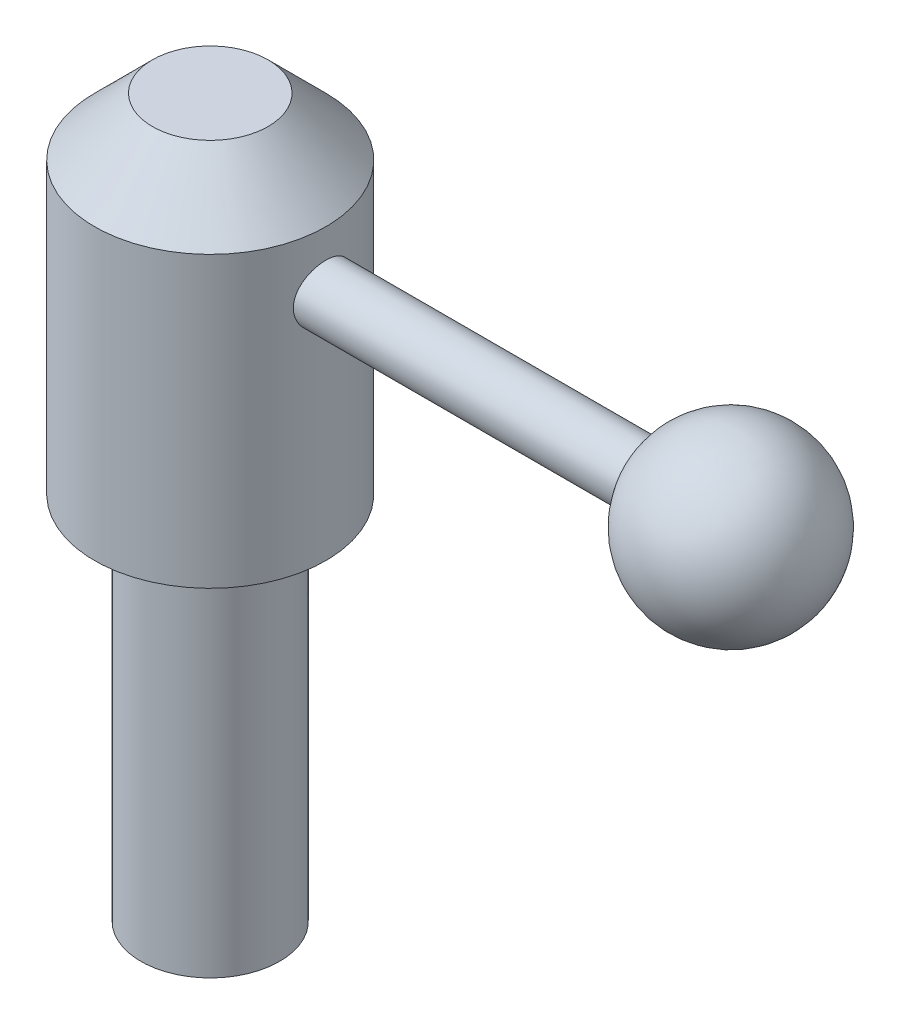
ISO-10303-21;
HEADER;
FILE_DESCRIPTION(('STEP AP214'),'2;1');
FILE_NAME('part.step','',(''),(''),'','','');
FILE_SCHEMA(('AUTOMOTIVE_DESIGN { 1 0 10303 214 1 1 1 1 }'));
ENDSEC;
DATA;
#1=APPLICATION_CONTEXT('core data for automotive mechanical design processes');
#2=APPLICATION_PROTOCOL_DEFINITION('international standard','automotive_design',2000,#1);
#3=PRODUCT_CONTEXT('',#1,'mechanical');
#4=PRODUCT('Part','Part','',(#3));
#5=PRODUCT_RELATED_PRODUCT_CATEGORY('part','',(#4));
#6=PRODUCT_DEFINITION_FORMATION('','',#4);
#7=PRODUCT_DEFINITION_CONTEXT('part definition',#1,'design');
#8=PRODUCT_DEFINITION('design','',#6,#7);
#9=PRODUCT_DEFINITION_SHAPE('','',#8);
#10=(LENGTH_UNIT() NAMED_UNIT(*) SI_UNIT(.MILLI.,.METRE.));
#11=(NAMED_UNIT(*) PLANE_ANGLE_UNIT() SI_UNIT($,.RADIAN.));
#12=(NAMED_UNIT(*) SI_UNIT($,.STERADIAN.) SOLID_ANGLE_UNIT());
#13=UNCERTAINTY_MEASURE_WITH_UNIT(LENGTH_MEASURE(1.E-05),#10,'distance_accuracy_value','');
#14=(GEOMETRIC_REPRESENTATION_CONTEXT(3) GLOBAL_UNCERTAINTY_ASSIGNED_CONTEXT((#13)) GLOBAL_UNIT_ASSIGNED_CONTEXT((#10,
#11,#12)) REPRESENTATION_CONTEXT('',''));
#15=CARTESIAN_POINT('',(0.,0.,0.));
#16=DIRECTION('',(0.,0.,1.));
#17=DIRECTION('',(1.,0.,0.));
#18=AXIS2_PLACEMENT_3D('',#15,#16,#17);
#19=CARTESIAN_POINT('',(0.,0.,0.));
#20=DIRECTION('',(0.,-1.,0.));
#21=DIRECTION('',(0.,0.,-1.));
#22=AXIS2_PLACEMENT_3D('',#19,#20,#21);
#23=CYLINDRICAL_SURFACE('',#22,10.);
#24=CARTESIAN_POINT('',(0.,57.,0.));
#25=DIRECTION('',(0.,-1.,0.));
#26=DIRECTION('',(0.,0.,-1.));
#27=AXIS2_PLACEMENT_3D('',#24,#25,#26);
#28=CIRCLE('',#27,10.);
#29=CARTESIAN_POINT('',(0.,57.,-10.));
#30=VERTEX_POINT('',#29);
#31=EDGE_CURVE('E64',#30,#30,#28,.T.);
#32=ORIENTED_EDGE('',*,*,#31,.T.);
#33=EDGE_LOOP('',(#32));
#34=FACE_BOUND('',#33,.T.);
#35=CARTESIAN_POINT('',(0.,32.,0.));
#36=DIRECTION('',(0.,-1.,0.));
#37=DIRECTION('',(0.,0.,-1.));
#38=AXIS2_PLACEMENT_3D('',#35,#36,#37);
#39=CIRCLE('',#38,9.99999999999999);
#40=CARTESIAN_POINT('',(0.,32.,-9.99999999999999));
#41=VERTEX_POINT('',#40);
#42=EDGE_CURVE('E69',#41,#41,#39,.T.);
#43=ORIENTED_EDGE('',*,*,#42,.F.);
#44=EDGE_LOOP('',(#43));
#45=FACE_BOUND('',#44,.T.);
#46=CARTESIAN_POINT('',(9.68245836551854,52.,2.5));
#47=CARTESIAN_POINT('',(9.68246100087859,51.8619492490734,2.49999607859307));
#48=CARTESIAN_POINT('',(9.68544306014597,51.7238551013215,2.48852624549765));
#49=CARTESIAN_POINT('',(9.69701861992564,51.4516324218265,2.44302312546379));
#50=CARTESIAN_POINT('',(9.7056153862163,51.3175062455318,2.40897670674211));
#51=CARTESIAN_POINT('',(9.7273872459615,51.0571964618128,2.31949119963204));
#52=CARTESIAN_POINT('',(9.74055642690458,50.9310028446143,2.26407972785449));
#53=CARTESIAN_POINT('',(9.76998192028759,50.6896891474601,2.13352114126139));
#54=CARTESIAN_POINT('',(9.78623836378489,50.5745695379198,2.05837318856069));
#55=CARTESIAN_POINT('',(9.82040716355625,50.3561383547378,1.88870842731188));
#56=CARTESIAN_POINT('',(9.83834597623034,50.25310639965,1.79383688770405));
#57=CARTESIAN_POINT('',(9.87362875515294,50.0642386056397,1.58818206410066));
#58=CARTESIAN_POINT('',(9.89097266566388,49.9784043743783,1.4773972941803));
#59=CARTESIAN_POINT('',(9.92340415520582,49.8252245323687,1.24114520107895));
#60=CARTESIAN_POINT('',(9.93845687400592,49.7581536118385,1.11549457619512));
#61=CARTESIAN_POINT('',(9.96430811925984,49.6461903558469,0.854263184292759));
#62=CARTESIAN_POINT('',(9.97510727334344,49.6012947480845,0.718683885791938));
#63=CARTESIAN_POINT('',(9.9910475884818,49.5358521654214,0.44435875875416));
#64=CARTESIAN_POINT('',(9.99629893844314,49.5148303556734,0.305732719548973));
#65=CARTESIAN_POINT('',(10.000935941073,49.4962416207244,0.0268288192627658));
#66=CARTESIAN_POINT('',(10.000322460967,49.4986712277904,-0.113448794538073));
#67=CARTESIAN_POINT('',(9.99338094953533,49.5265748502501,-0.388380617930973));
#68=CARTESIAN_POINT('',(9.9871800234087,49.5515363250539,-0.523090539002673));
#69=CARTESIAN_POINT('',(9.96990836524857,49.6229712700485,-0.786345618534221));
#70=CARTESIAN_POINT('',(9.95883737398452,49.6694458853774,-0.9148904484261));
#71=CARTESIAN_POINT('',(9.93287509700884,49.7830025706871,-1.16351675875452));
#72=CARTESIAN_POINT('',(9.9179501969501,49.8502670446617,-1.28351127441626));
#73=CARTESIAN_POINT('',(9.88589903809692,50.0033556791163,-1.51068905585123));
#74=CARTESIAN_POINT('',(9.8687723965265,50.0891830685606,-1.61787008771377));
#75=CARTESIAN_POINT('',(9.83363713769356,50.2797087419824,-1.81943508771239));
#76=CARTESIAN_POINT('',(9.81561719525297,50.3848548923478,-1.91339419768799));
#77=CARTESIAN_POINT('',(9.78115043517327,50.6095999735403,-2.08244093990756));
#78=CARTESIAN_POINT('',(9.76470369108288,50.7291995794911,-2.15752769011507));
#79=CARTESIAN_POINT('',(9.73520496829319,50.9802900341489,-2.28697032255647));
#80=CARTESIAN_POINT('',(9.72216983717007,51.1118357303128,-2.34122391742613));
#81=CARTESIAN_POINT('',(9.70118640148668,51.3825854680769,-2.42671405159096));
#82=CARTESIAN_POINT('',(9.69323700842732,51.5217878639846,-2.45795551638266));
#83=CARTESIAN_POINT('',(9.68355356007456,51.7999595015299,-2.49582963866592));
#84=CARTESIAN_POINT('',(9.68166088976933,51.938837793341,-2.50309047391912));
#85=CARTESIAN_POINT('',(9.68387343364692,52.2158219365853,-2.49451699051516));
#86=CARTESIAN_POINT('',(9.687978095703,52.3539278579494,-2.47868479784981));
#87=CARTESIAN_POINT('',(9.70157081984979,52.6231142649486,-2.42492546393825));
#88=CARTESIAN_POINT('',(9.71096970242531,52.7542727265692,-2.38736406828191));
#89=CARTESIAN_POINT('',(9.73400718262805,53.0084314578533,-2.29161808167046));
#90=CARTESIAN_POINT('',(9.74764628246407,53.1314307590558,-2.2334310477125));
#91=CARTESIAN_POINT('',(9.77796137095511,53.3684412778669,-2.0967706679366));
#92=CARTESIAN_POINT('',(9.79469168607245,53.482228840043,-2.01792175383564));
#93=CARTESIAN_POINT('',(9.82917083071113,53.6951883628015,-1.84265073233612));
#94=CARTESIAN_POINT('',(9.84691982728307,53.7943579166501,-1.74622573701359));
#95=CARTESIAN_POINT('',(9.88197403031773,53.9778110425709,-1.53565680246181));
#96=CARTESIAN_POINT('',(9.8992570206188,54.0616600625488,-1.42112988132898));
#97=CARTESIAN_POINT('',(9.93097216613689,54.2089358669513,-1.17925670673668));
#98=CARTESIAN_POINT('',(9.94540447003949,54.2723637166082,-1.05191112239397));
#99=CARTESIAN_POINT('',(9.96970115738325,54.3764460345279,-0.788895504327726));
#100=CARTESIAN_POINT('',(9.97959830022409,54.4172642843791,-0.653293452569705));
#101=CARTESIAN_POINT('',(9.99385293395789,54.4754603346084,-0.376874400797017));
#102=CARTESIAN_POINT('',(9.99821149393421,54.492842658739,-0.236058412603101));
#103=CARTESIAN_POINT('',(10.0008542352202,54.5034189739388,0.0427088161083089));
#104=CARTESIAN_POINT('',(9.99929947199971,54.4972542727385,0.180634567415056));
#105=CARTESIAN_POINT('',(9.99064741143608,54.4623804317641,0.453418741036879));
#106=CARTESIAN_POINT('',(9.98355027892922,54.4336719624671,0.588277254452324));
#107=CARTESIAN_POINT('',(9.96463582134723,54.3548694505729,0.850427589111937));
#108=CARTESIAN_POINT('',(9.95284411255981,54.3048913667141,0.977756236452158));
#109=CARTESIAN_POINT('',(9.92578222284145,54.1850735524511,1.22229263260406));
#110=CARTESIAN_POINT('',(9.91051160346894,54.1152313183238,1.33949910316409));
#111=CARTESIAN_POINT('',(9.87768124200717,53.9557119150097,1.56350482105826));
#112=CARTESIAN_POINT('',(9.86007542354161,53.8655996427404,1.66998747074584));
#113=CARTESIAN_POINT('',(9.82476622642974,53.6689428700566,1.86653755068376));
#114=CARTESIAN_POINT('',(9.80706282418255,53.5623942097221,1.95660081269148));
#115=CARTESIAN_POINT('',(9.77318689613756,53.3334964645263,2.11940506617958));
#116=CARTESIAN_POINT('',(9.75704909183222,53.2108896915869,2.19179154854095));
#117=CARTESIAN_POINT('',(9.7285988873707,52.954861275313,2.31481724146368));
#118=CARTESIAN_POINT('',(9.71628370583034,52.8214475847654,2.36547227438038));
#119=CARTESIAN_POINT('',(9.69879771876843,52.5735574704121,2.43605632142751));
#120=CARTESIAN_POINT('',(9.69271657508747,52.4602670890347,2.4599829264922));
#121=CARTESIAN_POINT('',(9.6845459645655,52.2313278275058,2.49195573142943));
#122=CARTESIAN_POINT('',(9.68245615722769,52.115679149389,2.50000328592938));
#123=CARTESIAN_POINT('',(9.68245836551854,52.,2.5));
#124=B_SPLINE_CURVE_WITH_KNOTS('',3,(#46,#47,#48,#49,#50,#51,#52,#53,#54,#55,#56,#57,#58,#59,
#60,#61,#62,#63,#64,#65,#66,#67,#68,#69,#70,#71,#72,#73,#74,#75,#76,#77,#78,#79,#80,#81,#82,#83,
#84,#85,#86,#87,#88,#89,#90,#91,#92,#93,#94,#95,#96,#97,#98,#99,#100,#101,#102,#103,#104,#105,
#106,#107,#108,#109,#110,#111,#112,#113,#114,#115,#116,#117,#118,#119,#120,#121,#122,#123),
.UNSPECIFIED.,.T.,.F.,(4,2,2,2,2,2,2,2,2,2,2,2,2,2,2,2,2,2,2,2,2,2,2,2,2,2,2,2,2,2,2,2,2,2,2,2,
2,2,4),(0.,0.413727441736142,0.82769574142867,1.24113072716601,1.65458326755479,
2.07623954192977,2.49793521479867,2.92551496397921,3.35303159847093,3.77188750995347,
4.19068148666021,4.60018262688948,5.00970556724787,5.42292874254445,5.83622385468915,
6.26070466571912,6.68520531199803,7.11176432008404,7.53823200129548,7.95343574764204,
8.36860127188748,8.77697405014152,9.18539521426364,9.60182845864104,10.0183301888999,
10.4452533097027,10.872154157245,11.2959207281187,11.7196054891398,12.131834461324,
12.5440511738193,12.9540487656466,13.3640980574302,13.7839709658702,14.2039503157046,
14.6317647729113,15.0592672137502,15.4059782718573,15.7526597510792),.UNSPECIFIED.);
#125=CARTESIAN_POINT('',(9.68245836551854,52.,2.5));
#126=VERTEX_POINT('',#125);
#127=EDGE_CURVE('E10',#126,#126,#124,.T.);
#128=ORIENTED_EDGE('',*,*,#127,.F.);
#129=EDGE_LOOP('',(#128));
#130=FACE_BOUND('',#129,.T.);
#131=ADVANCED_FACE('F45',(#34,#45,#130),#23,.T.);
#132=CARTESIAN_POINT('',(-6.,0.,0.));
#133=DIRECTION('',(0.,1.,0.));
#134=DIRECTION('',(0.,0.,1.));
#135=AXIS2_PLACEMENT_3D('',#132,#133,#134);
#136=PLANE('',#135);
#137=CARTESIAN_POINT('',(0.,0.,0.));
#138=DIRECTION('',(0.,-1.,0.));
#139=DIRECTION('',(0.,0.,-1.));
#140=AXIS2_PLACEMENT_3D('',#137,#138,#139);
#141=CIRCLE('',#140,6.);
#142=CARTESIAN_POINT('',(0.,0.,-6.));
#143=VERTEX_POINT('',#142);
#144=EDGE_CURVE('E79',#143,#143,#141,.T.);
#145=ORIENTED_EDGE('',*,*,#144,.T.);
#146=EDGE_LOOP('',(#145));
#147=FACE_BOUND('',#146,.T.);
#148=ADVANCED_FACE('F98',(#147),#136,.F.);
#149=CARTESIAN_POINT('',(0.,62.,0.));
#150=DIRECTION('',(0.,-1.,0.));
#151=DIRECTION('',(0.,0.,-1.));
#152=AXIS2_PLACEMENT_3D('',#149,#150,#151);
#153=PLANE('',#152);
#154=CARTESIAN_POINT('',(0.,62.,0.));
#155=DIRECTION('',(0.,-1.,0.));
#156=DIRECTION('',(0.,0.,-1.));
#157=AXIS2_PLACEMENT_3D('',#154,#155,#156);
#158=CIRCLE('',#157,4.99999999999998);
#159=CARTESIAN_POINT('',(0.,62.,-4.99999999999998));
#160=VERTEX_POINT('',#159);
#161=EDGE_CURVE('E59',#160,#160,#158,.F.);
#162=ORIENTED_EDGE('',*,*,#161,.T.);
#163=EDGE_LOOP('',(#162));
#164=FACE_BOUND('',#163,.T.);
#165=ADVANCED_FACE('F104',(#164),#153,.F.);
#166=CARTESIAN_POINT('',(-9.99999999999999,32.,0.));
#167=DIRECTION('',(0.,1.,0.));
#168=DIRECTION('',(0.,0.,1.));
#169=AXIS2_PLACEMENT_3D('',#166,#167,#168);
#170=PLANE('',#169);
#171=CARTESIAN_POINT('',(0.,32.,0.));
#172=DIRECTION('',(0.,-1.,0.));
#173=DIRECTION('',(0.,0.,-1.));
#174=AXIS2_PLACEMENT_3D('',#171,#172,#173);
#175=CIRCLE('',#174,6.);
#176=CARTESIAN_POINT('',(0.,32.,-6.));
#177=VERTEX_POINT('',#176);
#178=EDGE_CURVE('E75',#177,#177,#175,.T.);
#179=ORIENTED_EDGE('',*,*,#178,.F.);
#180=EDGE_LOOP('',(#179));
#181=FACE_BOUND('',#180,.T.);
#182=ORIENTED_EDGE('',*,*,#42,.T.);
#183=EDGE_LOOP('',(#182));
#184=FACE_BOUND('',#183,.T.);
#185=ADVANCED_FACE('F110',(#181,#184),#170,.F.);
#186=CARTESIAN_POINT('',(0.,0.,0.));
#187=DIRECTION('',(0.,-1.,0.));
#188=DIRECTION('',(0.,0.,-1.));
#189=AXIS2_PLACEMENT_3D('',#186,#187,#188);
#190=CYLINDRICAL_SURFACE('',#189,6.);
#191=ORIENTED_EDGE('',*,*,#144,.F.);
#192=EDGE_LOOP('',(#191));
#193=FACE_BOUND('',#192,.T.);
#194=ORIENTED_EDGE('',*,*,#178,.T.);
#195=EDGE_LOOP('',(#194));
#196=FACE_BOUND('',#195,.T.);
#197=ADVANCED_FACE('F116',(#193,#196),#190,.T.);
#198=CARTESIAN_POINT('',(0.,57.,0.));
#199=DIRECTION('',(0.,-1.,0.));
#200=DIRECTION('',(0.,0.,-1.));
#201=AXIS2_PLACEMENT_3D('',#198,#199,#200);
#202=CONICAL_SURFACE('',#201,10.,0.78539816339745);
#203=ORIENTED_EDGE('',*,*,#161,.F.);
#204=EDGE_LOOP('',(#203));
#205=FACE_BOUND('',#204,.T.);
#206=ORIENTED_EDGE('',*,*,#31,.F.);
#207=EDGE_LOOP('',(#206));
#208=FACE_BOUND('',#207,.T.);
#209=ADVANCED_FACE('F48',(#205,#208),#202,.T.);
#210=CARTESIAN_POINT('',(0.,52.,0.));
#211=DIRECTION('',(-1.,0.,0.));
#212=DIRECTION('',(0.,0.,1.));
#213=AXIS2_PLACEMENT_3D('',#210,#211,#212);
#214=CYLINDRICAL_SURFACE('',#213,2.5);
#215=CARTESIAN_POINT('',(37.9289321881345,52.,0.));
#216=DIRECTION('',(-1.,0.,0.));
#217=DIRECTION('',(0.,0.,1.));
#218=AXIS2_PLACEMENT_3D('',#215,#216,#217);
#219=CIRCLE('',#218,2.5);
#220=CARTESIAN_POINT('',(37.9289321881345,52.,2.5));
#221=VERTEX_POINT('',#220);
#222=EDGE_CURVE('E83',#221,#221,#219,.T.);
#223=ORIENTED_EDGE('',*,*,#222,.T.);
#224=EDGE_LOOP('',(#223));
#225=FACE_BOUND('',#224,.T.);
#226=ORIENTED_EDGE('',*,*,#127,.T.);
#227=EDGE_LOOP('',(#226));
#228=FACE_BOUND('',#227,.T.);
#229=ADVANCED_FACE('F88',(#225,#228),#214,.T.);
#230=CARTESIAN_POINT('',(45.,52.,0.));
#231=DIRECTION('',(-1.,0.,0.));
#232=DIRECTION('',(0.,1.,0.));
#233=AXIS2_PLACEMENT_3D('',#230,#231,#232);
#234=SPHERICAL_SURFACE('',#233,7.5);
#235=ORIENTED_EDGE('',*,*,#222,.F.);
#236=EDGE_LOOP('',(#235));
#237=FACE_BOUND('',#236,.T.);
#238=ADVANCED_FACE('F90',(#237),#234,.T.);
#239=CLOSED_SHELL('',(#131,#148,#165,#185,#197,#209,#229,#238));
#240=MANIFOLD_SOLID_BREP('B2',#239);
#241=ADVANCED_BREP_SHAPE_REPRESENTATION('',(#18,#240),#14);
#242=SHAPE_DEFINITION_REPRESENTATION(#9,#241);
ENDSEC;
END-ISO-10303-21;
